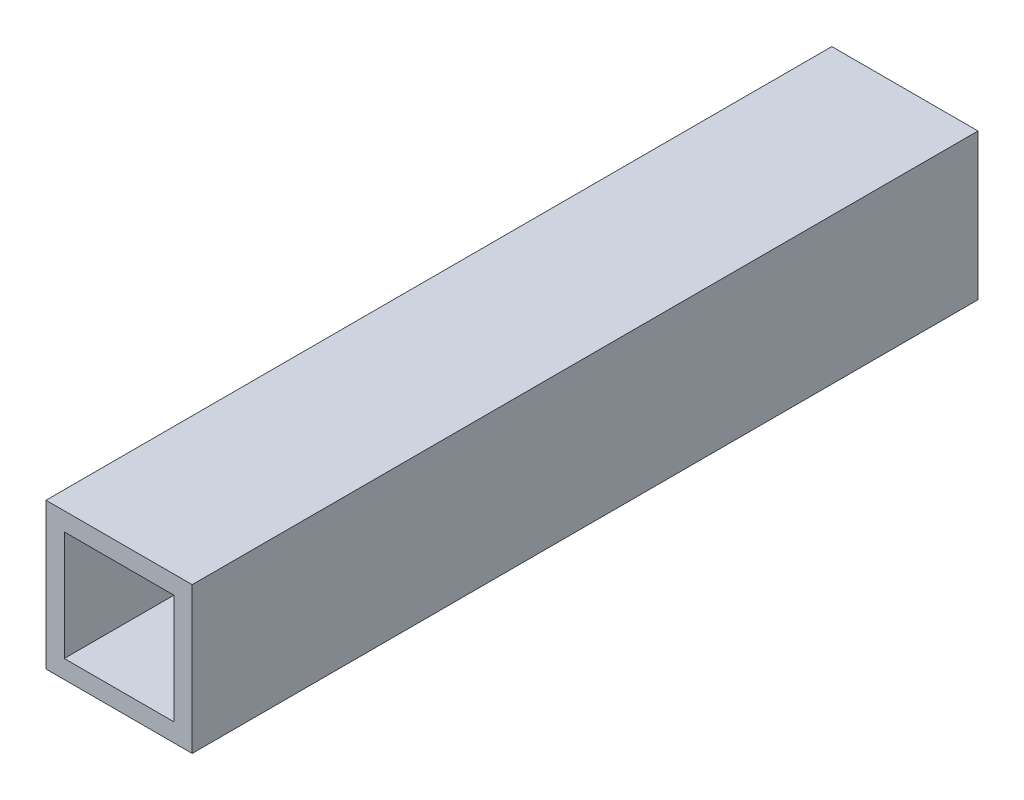
ISO-10303-21;
HEADER;
FILE_DESCRIPTION(('STEP AP214'),'2;1');
FILE_NAME('part.step','',(''),(''),'','','');
FILE_SCHEMA(('AUTOMOTIVE_DESIGN { 1 0 10303 214 1 1 1 1 }'));
ENDSEC;
DATA;
#1=APPLICATION_CONTEXT('core data for automotive mechanical design processes');
#2=APPLICATION_PROTOCOL_DEFINITION('international standard','automotive_design',2000,#1);
#3=PRODUCT_CONTEXT('',#1,'mechanical');
#4=PRODUCT('Part','Part','',(#3));
#5=PRODUCT_RELATED_PRODUCT_CATEGORY('part','',(#4));
#6=PRODUCT_DEFINITION_FORMATION('','',#4);
#7=PRODUCT_DEFINITION_CONTEXT('part definition',#1,'design');
#8=PRODUCT_DEFINITION('design','',#6,#7);
#9=PRODUCT_DEFINITION_SHAPE('','',#8);
#10=(LENGTH_UNIT() NAMED_UNIT(*) SI_UNIT(.MILLI.,.METRE.));
#11=(NAMED_UNIT(*) PLANE_ANGLE_UNIT() SI_UNIT($,.RADIAN.));
#12=(NAMED_UNIT(*) SI_UNIT($,.STERADIAN.) SOLID_ANGLE_UNIT());
#13=UNCERTAINTY_MEASURE_WITH_UNIT(LENGTH_MEASURE(1.E-05),#10,'distance_accuracy_value','');
#14=(GEOMETRIC_REPRESENTATION_CONTEXT(3) GLOBAL_UNCERTAINTY_ASSIGNED_CONTEXT((#13)) GLOBAL_UNIT_ASSIGNED_CONTEXT((#10,
#11,#12)) REPRESENTATION_CONTEXT('',''));
#15=CARTESIAN_POINT('',(0.,0.,0.));
#16=DIRECTION('',(0.,0.,1.));
#17=DIRECTION('',(1.,0.,0.));
#18=AXIS2_PLACEMENT_3D('',#15,#16,#17);
#19=CARTESIAN_POINT('',(19.05,19.05,0.));
#20=DIRECTION('',(-1.,0.,0.));
#21=DIRECTION('',(0.,0.,1.));
#22=AXIS2_PLACEMENT_3D('',#19,#20,#21);
#23=PLANE('',#22);
#24=DIRECTION('',(0.,1.,0.));
#25=VECTOR('',#24,1.);
#26=CARTESIAN_POINT('',(19.05,0.,273.05));
#27=LINE('',#26,#25);
#28=CARTESIAN_POINT('',(19.05,19.05,273.05));
#29=VERTEX_POINT('',#28);
#30=CARTESIAN_POINT('',(19.05,-19.05,273.05));
#31=VERTEX_POINT('',#30);
#32=EDGE_CURVE('E121',#29,#31,#27,.F.);
#33=ORIENTED_EDGE('',*,*,#32,.F.);
#34=DIRECTION('',(0.,0.,-1.));
#35=VECTOR('',#34,1.);
#36=CARTESIAN_POINT('',(19.05,19.05,0.));
#37=LINE('',#36,#35);
#38=CARTESIAN_POINT('',(19.05,19.05,0.));
#39=VERTEX_POINT('',#38);
#40=EDGE_CURVE('E97',#39,#29,#37,.F.);
#41=ORIENTED_EDGE('',*,*,#40,.F.);
#42=DIRECTION('',(0.,1.,0.));
#43=VECTOR('',#42,1.);
#44=CARTESIAN_POINT('',(19.05,0.,0.));
#45=LINE('',#44,#43);
#46=CARTESIAN_POINT('',(19.05,-19.05,0.));
#47=VERTEX_POINT('',#46);
#48=EDGE_CURVE('E104',#39,#47,#45,.F.);
#49=ORIENTED_EDGE('',*,*,#48,.T.);
#50=DIRECTION('',(0.,0.,1.));
#51=VECTOR('',#50,1.);
#52=CARTESIAN_POINT('',(19.05,-19.05,0.));
#53=LINE('',#52,#51);
#54=EDGE_CURVE('E19',#31,#47,#53,.F.);
#55=ORIENTED_EDGE('',*,*,#54,.F.);
#56=EDGE_LOOP('',(#33,#41,#49,#55));
#57=FACE_BOUND('',#56,.T.);
#58=ADVANCED_FACE('F16',(#57),#23,.T.);
#59=CARTESIAN_POINT('',(19.05,-19.05,0.));
#60=DIRECTION('',(0.,1.,0.));
#61=DIRECTION('',(0.,0.,1.));
#62=AXIS2_PLACEMENT_3D('',#59,#60,#61);
#63=PLANE('',#62);
#64=DIRECTION('',(1.,0.,0.));
#65=VECTOR('',#64,1.);
#66=CARTESIAN_POINT('',(0.,-19.05,273.05));
#67=LINE('',#66,#65);
#68=CARTESIAN_POINT('',(-19.05,-19.05,273.05));
#69=VERTEX_POINT('',#68);
#70=EDGE_CURVE('E126',#31,#69,#67,.F.);
#71=ORIENTED_EDGE('',*,*,#70,.F.);
#72=ORIENTED_EDGE('',*,*,#54,.T.);
#73=DIRECTION('',(1.,0.,0.));
#74=VECTOR('',#73,1.);
#75=CARTESIAN_POINT('',(0.,-19.05,0.));
#76=LINE('',#75,#74);
#77=CARTESIAN_POINT('',(-19.05,-19.05,0.));
#78=VERTEX_POINT('',#77);
#79=EDGE_CURVE('E80',#47,#78,#76,.F.);
#80=ORIENTED_EDGE('',*,*,#79,.T.);
#81=DIRECTION('',(0.,0.,-1.));
#82=VECTOR('',#81,1.);
#83=CARTESIAN_POINT('',(-19.05,-19.05,0.));
#84=LINE('',#83,#82);
#85=EDGE_CURVE('E83',#69,#78,#84,.T.);
#86=ORIENTED_EDGE('',*,*,#85,.F.);
#87=EDGE_LOOP('',(#71,#72,#80,#86));
#88=FACE_BOUND('',#87,.T.);
#89=ADVANCED_FACE('F82',(#88),#63,.T.);
#90=CARTESIAN_POINT('',(-19.05,-19.05,0.));
#91=DIRECTION('',(1.,0.,0.));
#92=DIRECTION('',(0.,0.,-1.));
#93=AXIS2_PLACEMENT_3D('',#90,#91,#92);
#94=PLANE('',#93);
#95=DIRECTION('',(0.,1.,0.));
#96=VECTOR('',#95,1.);
#97=CARTESIAN_POINT('',(-19.05,0.,273.05));
#98=LINE('',#97,#96);
#99=CARTESIAN_POINT('',(-19.05,19.05,273.05));
#100=VERTEX_POINT('',#99);
#101=EDGE_CURVE('E95',#69,#100,#98,.T.);
#102=ORIENTED_EDGE('',*,*,#101,.F.);
#103=ORIENTED_EDGE('',*,*,#85,.T.);
#104=DIRECTION('',(0.,1.,0.));
#105=VECTOR('',#104,1.);
#106=CARTESIAN_POINT('',(-19.05,0.,0.));
#107=LINE('',#106,#105);
#108=CARTESIAN_POINT('',(-19.05,19.05,0.));
#109=VERTEX_POINT('',#108);
#110=EDGE_CURVE('E88',#78,#109,#107,.T.);
#111=ORIENTED_EDGE('',*,*,#110,.T.);
#112=DIRECTION('',(0.,0.,-1.));
#113=VECTOR('',#112,1.);
#114=CARTESIAN_POINT('',(-19.05,19.05,0.));
#115=LINE('',#114,#113);
#116=EDGE_CURVE('E109',#100,#109,#115,.T.);
#117=ORIENTED_EDGE('',*,*,#116,.F.);
#118=EDGE_LOOP('',(#102,#103,#111,#117));
#119=FACE_BOUND('',#118,.T.);
#120=ADVANCED_FACE('F92',(#119),#94,.T.);
#121=CARTESIAN_POINT('',(-19.05,19.05,0.));
#122=DIRECTION('',(0.,-1.,0.));
#123=DIRECTION('',(0.,0.,-1.));
#124=AXIS2_PLACEMENT_3D('',#121,#122,#123);
#125=PLANE('',#124);
#126=DIRECTION('',(1.,0.,0.));
#127=VECTOR('',#126,1.);
#128=CARTESIAN_POINT('',(0.,19.05,273.05));
#129=LINE('',#128,#127);
#130=EDGE_CURVE('E116',#100,#29,#129,.T.);
#131=ORIENTED_EDGE('',*,*,#130,.F.);
#132=ORIENTED_EDGE('',*,*,#116,.T.);
#133=DIRECTION('',(1.,0.,0.));
#134=VECTOR('',#133,1.);
#135=CARTESIAN_POINT('',(0.,19.05,0.));
#136=LINE('',#135,#134);
#137=EDGE_CURVE('E102',#109,#39,#136,.T.);
#138=ORIENTED_EDGE('',*,*,#137,.T.);
#139=ORIENTED_EDGE('',*,*,#40,.T.);
#140=EDGE_LOOP('',(#131,#132,#138,#139));
#141=FACE_BOUND('',#140,.T.);
#142=ADVANCED_FACE('F115',(#141),#125,.T.);
#143=CARTESIAN_POINT('',(25.4,25.4,0.));
#144=DIRECTION('',(0.,1.,0.));
#145=DIRECTION('',(0.,0.,1.));
#146=AXIS2_PLACEMENT_3D('',#143,#144,#145);
#147=PLANE('',#146);
#148=DIRECTION('',(1.,0.,0.));
#149=VECTOR('',#148,1.);
#150=CARTESIAN_POINT('',(0.,25.4,273.05));
#151=LINE('',#150,#149);
#152=CARTESIAN_POINT('',(25.4,25.4,273.05));
#153=VERTEX_POINT('',#152);
#154=CARTESIAN_POINT('',(-25.4,25.4,273.05));
#155=VERTEX_POINT('',#154);
#156=EDGE_CURVE('E132',#153,#155,#151,.F.);
#157=ORIENTED_EDGE('',*,*,#156,.F.);
#158=DIRECTION('',(0.,0.,-1.));
#159=VECTOR('',#158,1.);
#160=CARTESIAN_POINT('',(25.4,25.4,0.));
#161=LINE('',#160,#159);
#162=CARTESIAN_POINT('',(25.4,25.4,0.));
#163=VERTEX_POINT('',#162);
#164=EDGE_CURVE('E137',#163,#153,#161,.F.);
#165=ORIENTED_EDGE('',*,*,#164,.F.);
#166=DIRECTION('',(1.,0.,0.));
#167=VECTOR('',#166,1.);
#168=CARTESIAN_POINT('',(0.,25.4,0.));
#169=LINE('',#168,#167);
#170=CARTESIAN_POINT('',(-25.4,25.4,0.));
#171=VERTEX_POINT('',#170);
#172=EDGE_CURVE('E89',#163,#171,#169,.F.);
#173=ORIENTED_EDGE('',*,*,#172,.T.);
#174=DIRECTION('',(0.,0.,1.));
#175=VECTOR('',#174,1.);
#176=CARTESIAN_POINT('',(-25.4,25.4,0.));
#177=LINE('',#176,#175);
#178=EDGE_CURVE('E240',#155,#171,#177,.F.);
#179=ORIENTED_EDGE('',*,*,#178,.F.);
#180=EDGE_LOOP('',(#157,#165,#173,#179));
#181=FACE_BOUND('',#180,.T.);
#182=ADVANCED_FACE('F166',(#181),#147,.T.);
#183=CARTESIAN_POINT('',(0.,0.,0.));
#184=DIRECTION('',(0.,0.,1.));
#185=DIRECTION('',(1.,0.,0.));
#186=AXIS2_PLACEMENT_3D('',#183,#184,#185);
#187=PLANE('',#186);
#188=ORIENTED_EDGE('',*,*,#137,.F.);
#189=ORIENTED_EDGE('',*,*,#110,.F.);
#190=ORIENTED_EDGE('',*,*,#79,.F.);
#191=ORIENTED_EDGE('',*,*,#48,.F.);
#192=EDGE_LOOP('',(#188,#189,#190,#191));
#193=FACE_BOUND('',#192,.T.);
#194=DIRECTION('',(0.,1.,0.));
#195=VECTOR('',#194,1.);
#196=CARTESIAN_POINT('',(-25.4,25.4,0.));
#197=LINE('',#196,#195);
#198=CARTESIAN_POINT('',(-25.4,-25.4,0.));
#199=VERTEX_POINT('',#198);
#200=EDGE_CURVE('E122',#171,#199,#197,.F.);
#201=ORIENTED_EDGE('',*,*,#200,.F.);
#202=ORIENTED_EDGE('',*,*,#172,.F.);
#203=DIRECTION('',(0.,1.,0.));
#204=VECTOR('',#203,1.);
#205=CARTESIAN_POINT('',(25.4,-25.4,0.));
#206=LINE('',#205,#204);
#207=CARTESIAN_POINT('',(25.4,-25.4,0.));
#208=VERTEX_POINT('',#207);
#209=EDGE_CURVE('E139',#208,#163,#206,.T.);
#210=ORIENTED_EDGE('',*,*,#209,.F.);
#211=DIRECTION('',(1.,0.,0.));
#212=VECTOR('',#211,1.);
#213=CARTESIAN_POINT('',(-25.4,-25.4,0.));
#214=LINE('',#213,#212);
#215=EDGE_CURVE('E246',#199,#208,#214,.T.);
#216=ORIENTED_EDGE('',*,*,#215,.F.);
#217=EDGE_LOOP('',(#201,#202,#210,#216));
#218=FACE_BOUND('',#217,.T.);
#219=ADVANCED_FACE('F99',(#193,#218),#187,.F.);
#220=CARTESIAN_POINT('',(25.4,-25.4,0.));
#221=DIRECTION('',(1.,0.,0.));
#222=DIRECTION('',(0.,0.,-1.));
#223=AXIS2_PLACEMENT_3D('',#220,#221,#222);
#224=PLANE('',#223);
#225=DIRECTION('',(0.,1.,0.));
#226=VECTOR('',#225,1.);
#227=CARTESIAN_POINT('',(25.4,0.,273.05));
#228=LINE('',#227,#226);
#229=CARTESIAN_POINT('',(25.4,-25.4,273.05));
#230=VERTEX_POINT('',#229);
#231=EDGE_CURVE('E134',#230,#153,#228,.T.);
#232=ORIENTED_EDGE('',*,*,#231,.F.);
#233=DIRECTION('',(0.,0.,-1.));
#234=VECTOR('',#233,1.);
#235=CARTESIAN_POINT('',(25.4,-25.4,0.));
#236=LINE('',#235,#234);
#237=EDGE_CURVE('E243',#208,#230,#236,.F.);
#238=ORIENTED_EDGE('',*,*,#237,.F.);
#239=ORIENTED_EDGE('',*,*,#209,.T.);
#240=ORIENTED_EDGE('',*,*,#164,.T.);
#241=EDGE_LOOP('',(#232,#238,#239,#240));
#242=FACE_BOUND('',#241,.T.);
#243=ADVANCED_FACE('F160',(#242),#224,.T.);
#244=CARTESIAN_POINT('',(0.,0.,273.05));
#245=DIRECTION('',(0.,0.,1.));
#246=DIRECTION('',(1.,0.,0.));
#247=AXIS2_PLACEMENT_3D('',#244,#245,#246);
#248=PLANE('',#247);
#249=ORIENTED_EDGE('',*,*,#101,.T.);
#250=ORIENTED_EDGE('',*,*,#130,.T.);
#251=ORIENTED_EDGE('',*,*,#32,.T.);
#252=ORIENTED_EDGE('',*,*,#70,.T.);
#253=EDGE_LOOP('',(#249,#250,#251,#252));
#254=FACE_BOUND('',#253,.T.);
#255=ORIENTED_EDGE('',*,*,#156,.T.);
#256=DIRECTION('',(0.,1.,0.));
#257=VECTOR('',#256,1.);
#258=CARTESIAN_POINT('',(-25.4,25.4,273.05));
#259=LINE('',#258,#257);
#260=CARTESIAN_POINT('',(-25.4,-25.4,273.05));
#261=VERTEX_POINT('',#260);
#262=EDGE_CURVE('E34',#261,#155,#259,.T.);
#263=ORIENTED_EDGE('',*,*,#262,.F.);
#264=DIRECTION('',(1.,0.,0.));
#265=VECTOR('',#264,1.);
#266=CARTESIAN_POINT('',(-25.4,-25.4,273.05));
#267=LINE('',#266,#265);
#268=EDGE_CURVE('E25',#230,#261,#267,.F.);
#269=ORIENTED_EDGE('',*,*,#268,.F.);
#270=ORIENTED_EDGE('',*,*,#231,.T.);
#271=EDGE_LOOP('',(#255,#263,#269,#270));
#272=FACE_BOUND('',#271,.T.);
#273=ADVANCED_FACE('F120',(#254,#272),#248,.T.);
#274=CARTESIAN_POINT('',(-25.4,25.4,0.));
#275=DIRECTION('',(-1.,0.,0.));
#276=DIRECTION('',(0.,0.,1.));
#277=AXIS2_PLACEMENT_3D('',#274,#275,#276);
#278=PLANE('',#277);
#279=ORIENTED_EDGE('',*,*,#262,.T.);
#280=ORIENTED_EDGE('',*,*,#178,.T.);
#281=ORIENTED_EDGE('',*,*,#200,.T.);
#282=DIRECTION('',(0.,0.,-1.));
#283=VECTOR('',#282,1.);
#284=CARTESIAN_POINT('',(-25.4,-25.4,0.));
#285=LINE('',#284,#283);
#286=EDGE_CURVE('E11',#261,#199,#285,.T.);
#287=ORIENTED_EDGE('',*,*,#286,.F.);
#288=EDGE_LOOP('',(#279,#280,#281,#287));
#289=FACE_BOUND('',#288,.T.);
#290=ADVANCED_FACE('F148',(#289),#278,.T.);
#291=CARTESIAN_POINT('',(-25.4,-25.4,0.));
#292=DIRECTION('',(0.,-1.,0.));
#293=DIRECTION('',(0.,0.,-1.));
#294=AXIS2_PLACEMENT_3D('',#291,#292,#293);
#295=PLANE('',#294);
#296=ORIENTED_EDGE('',*,*,#268,.T.);
#297=ORIENTED_EDGE('',*,*,#286,.T.);
#298=ORIENTED_EDGE('',*,*,#215,.T.);
#299=ORIENTED_EDGE('',*,*,#237,.T.);
#300=EDGE_LOOP('',(#296,#297,#298,#299));
#301=FACE_BOUND('',#300,.T.);
#302=ADVANCED_FACE('F146',(#301),#295,.T.);
#303=CLOSED_SHELL('',(#58,#89,#120,#142,#182,#219,#243,#273,#290,#302));
#304=MANIFOLD_SOLID_BREP('B1',#303);
#305=ADVANCED_BREP_SHAPE_REPRESENTATION('',(#18,#304),#14);
#306=SHAPE_DEFINITION_REPRESENTATION(#9,#305);
ENDSEC;
END-ISO-10303-21;
